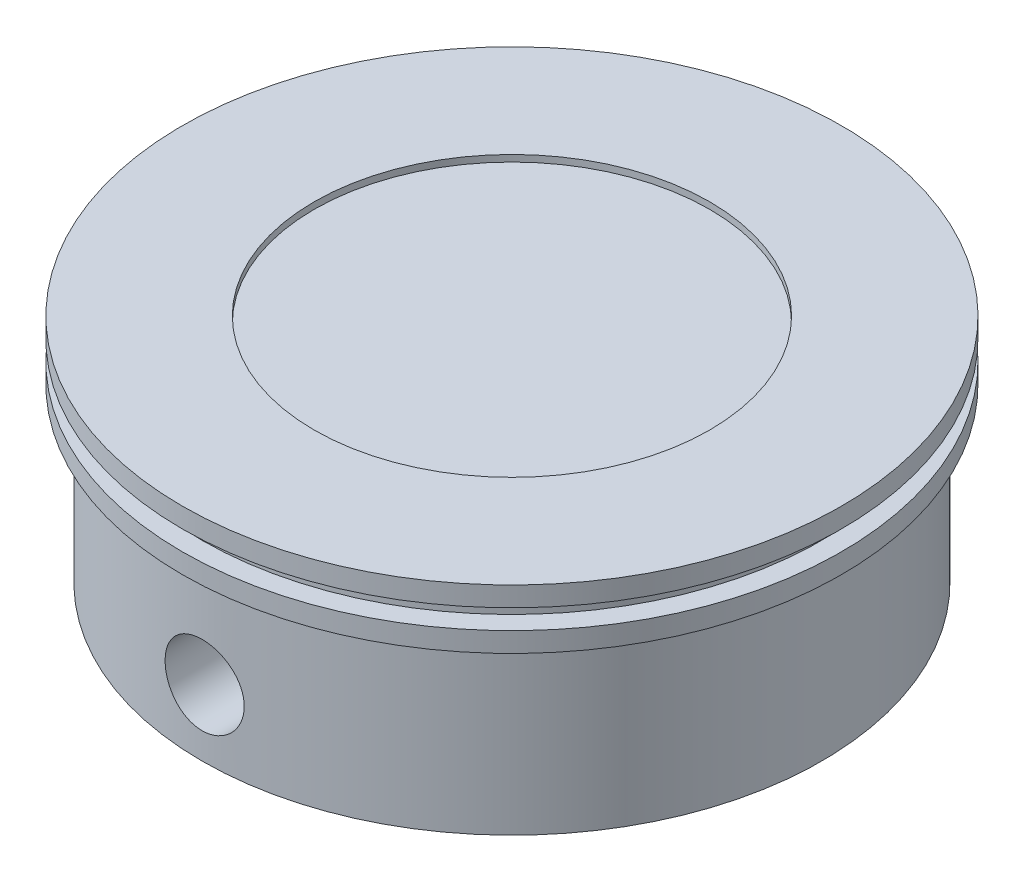
ISO-10303-21;
HEADER;
FILE_DESCRIPTION(('STEP AP214'),'2;1');
FILE_NAME('part.step','',(''),(''),'','','');
FILE_SCHEMA(('AUTOMOTIVE_DESIGN { 1 0 10303 214 1 1 1 1 }'));
ENDSEC;
DATA;
#1=APPLICATION_CONTEXT('core data for automotive mechanical design processes');
#2=APPLICATION_PROTOCOL_DEFINITION('international standard','automotive_design',2000,#1);
#3=PRODUCT_CONTEXT('',#1,'mechanical');
#4=PRODUCT('Part','Part','',(#3));
#5=PRODUCT_RELATED_PRODUCT_CATEGORY('part','',(#4));
#6=PRODUCT_DEFINITION_FORMATION('','',#4);
#7=PRODUCT_DEFINITION_CONTEXT('part definition',#1,'design');
#8=PRODUCT_DEFINITION('design','',#6,#7);
#9=PRODUCT_DEFINITION_SHAPE('','',#8);
#10=(LENGTH_UNIT() NAMED_UNIT(*) SI_UNIT(.MILLI.,.METRE.));
#11=(NAMED_UNIT(*) PLANE_ANGLE_UNIT() SI_UNIT($,.RADIAN.));
#12=(NAMED_UNIT(*) SI_UNIT($,.STERADIAN.) SOLID_ANGLE_UNIT());
#13=UNCERTAINTY_MEASURE_WITH_UNIT(LENGTH_MEASURE(1.E-05),#10,'distance_accuracy_value','');
#14=(GEOMETRIC_REPRESENTATION_CONTEXT(3) GLOBAL_UNCERTAINTY_ASSIGNED_CONTEXT((#13)) GLOBAL_UNIT_ASSIGNED_CONTEXT((#10,
#11,#12)) REPRESENTATION_CONTEXT('',''));
#15=CARTESIAN_POINT('',(0.,0.,0.));
#16=DIRECTION('',(0.,0.,1.));
#17=DIRECTION('',(1.,0.,0.));
#18=AXIS2_PLACEMENT_3D('',#15,#16,#17);
#19=CARTESIAN_POINT('',(0.,-14.0648148148148,0.));
#20=DIRECTION('',(0.,1.,0.));
#21=DIRECTION('',(0.,0.,1.));
#22=AXIS2_PLACEMENT_3D('',#19,#20,#21);
#23=PLANE('',#22);
#24=CARTESIAN_POINT('',(0.,-14.0648148148148,0.));
#25=DIRECTION('',(0.,-1.,0.));
#26=DIRECTION('',(0.,0.,-1.));
#27=AXIS2_PLACEMENT_3D('',#24,#25,#26);
#28=CIRCLE('',#27,30.);
#29=CARTESIAN_POINT('',(0.,-14.0648148148148,-30.));
#30=VERTEX_POINT('',#29);
#31=EDGE_CURVE('E129',#30,#30,#28,.T.);
#32=ORIENTED_EDGE('',*,*,#31,.F.);
#33=EDGE_LOOP('',(#32));
#34=FACE_BOUND('',#33,.T.);
#35=CARTESIAN_POINT('',(0.,-14.0648148148148,0.));
#36=DIRECTION('',(0.,1.,0.));
#37=DIRECTION('',(0.,0.,1.));
#38=AXIS2_PLACEMENT_3D('',#35,#36,#37);
#39=CIRCLE('',#38,47.);
#40=CARTESIAN_POINT('',(0.,-14.0648148148148,47.));
#41=VERTEX_POINT('',#40);
#42=EDGE_CURVE('E10',#41,#41,#39,.T.);
#43=ORIENTED_EDGE('',*,*,#42,.F.);
#44=EDGE_LOOP('',(#43));
#45=FACE_BOUND('',#44,.T.);
#46=ADVANCED_FACE('F31',(#34,#45),#23,.F.);
#47=CARTESIAN_POINT('',(0.,20.9351851851852,0.));
#48=DIRECTION('',(0.,1.,0.));
#49=DIRECTION('',(0.,0.,1.));
#50=AXIS2_PLACEMENT_3D('',#47,#48,#49);
#51=CYLINDRICAL_SURFACE('',#50,47.);
#52=CARTESIAN_POINT('',(6.,-4.06481481481481,-46.6154480832267));
#53=CARTESIAN_POINT('',(6.00000196138387,-3.89698301913016,-46.6154473928351));
#54=CARTESIAN_POINT('',(5.99295562179024,-3.72917986886561,-46.6163562902828));
#55=CARTESIAN_POINT('',(5.96482465134181,-3.39472070375308,-46.619964373645));
#56=CARTESIAN_POINT('',(5.94373685983059,-3.22806495571445,-46.6226639626342));
#57=CARTESIAN_POINT('',(5.88765444257299,-2.89702485864699,-46.6297793289132));
#58=CARTESIAN_POINT('',(5.85264953950258,-2.73264228131749,-46.6341963744345));
#59=CARTESIAN_POINT('',(5.76897846514975,-2.40737825607982,-46.6446209557841));
#60=CARTESIAN_POINT('',(5.7203072882093,-2.24649811434681,-46.6506290743418));
#61=CARTESIAN_POINT('',(5.60972590569106,-1.92960804180157,-46.6640554497734));
#62=CARTESIAN_POINT('',(5.54782981942478,-1.7735931187221,-46.6714722018168));
#63=CARTESIAN_POINT('',(5.41119174183208,-1.4672895933687,-46.6875115459794));
#64=CARTESIAN_POINT('',(5.33644501884744,-1.31700312532613,-46.6961345820388));
#65=CARTESIAN_POINT('',(5.17470088804053,-1.02334228842754,-46.7143349154737));
#66=CARTESIAN_POINT('',(5.08771016996276,-0.879964202085282,-46.7239116909251));
#67=CARTESIAN_POINT('',(4.90202753061555,-0.600970767862642,-46.7437572683162));
#68=CARTESIAN_POINT('',(4.8033312761572,-0.465358322408734,-46.7540263259159));
#69=CARTESIAN_POINT('',(4.59444810261927,-0.202251245275427,-46.7750159174757));
#70=CARTESIAN_POINT('',(4.48420784963096,-0.074799108468153,-46.7857383970622));
#71=CARTESIAN_POINT('',(4.25336390551098,0.170425695379805,-46.8072893337701));
#72=CARTESIAN_POINT('',(4.13275639635765,0.288194764859899,-46.8181178286224));
#73=CARTESIAN_POINT('',(3.88209272514657,0.513143837596703,-46.8395684210856));
#74=CARTESIAN_POINT('',(3.75203957371098,0.62032718937295,-46.8501905831051));
#75=CARTESIAN_POINT('',(3.48330532790937,0.823432557743039,-46.8709371531523));
#76=CARTESIAN_POINT('',(3.34462106875755,0.919350405927563,-46.8810613761346));
#77=CARTESIAN_POINT('',(3.05919121476146,1.09947740865912,-46.9005529648045));
#78=CARTESIAN_POINT('',(2.91242201313194,1.1836494309159,-46.9099178926984));
#79=CARTESIAN_POINT('',(2.61219783113748,1.33935327066616,-46.9275936662918));
#80=CARTESIAN_POINT('',(2.45874038939118,1.41088038481983,-46.935904119451));
#81=CARTESIAN_POINT('',(2.14632461863652,1.54070726026251,-46.9512269280142));
#82=CARTESIAN_POINT('',(1.98736851593013,1.59901230431264,-46.9582398016478));
#83=CARTESIAN_POINT('',(1.66503326060465,1.70201689659562,-46.9707757437606));
#84=CARTESIAN_POINT('',(1.50165250779416,1.74671144901397,-46.9762982651125));
#85=CARTESIAN_POINT('',(1.0085416390629,1.85935739719462,-46.9903178080245));
#86=CARTESIAN_POINT('',(0.673772658507812,1.90672845377963,-46.9963714271072));
#87=CARTESIAN_POINT('',(0.00116856767452578,1.94464581142033,-47.0012054263665));
#88=CARTESIAN_POINT('',(-0.336666416528268,1.93519443856246,-46.9999861042685));
#89=CARTESIAN_POINT('',(-1.00396247855509,1.86005407580517,-46.9904534013821));
#90=CARTESIAN_POINT('',(-1.33346084614895,1.79469266985978,-46.9821813443819));
#91=CARTESIAN_POINT('',(-1.97676049714717,1.61007992427992,-46.9595156526157));
#92=CARTESIAN_POINT('',(-2.2905614712102,1.49082752310468,-46.9451218972653));
#93=CARTESIAN_POINT('',(-2.89458674366409,1.20147607763343,-46.911759785554));
#94=CARTESIAN_POINT('',(-3.184742574148,1.03123561150983,-46.8927787343963));
#95=CARTESIAN_POINT('',(-3.73248989239658,0.644842025811271,-46.8523645801171));
#96=CARTESIAN_POINT('',(-3.99007982179162,0.428686710407619,-46.8309313597459));
#97=CARTESIAN_POINT('',(-4.46731017913027,-0.0452346433143295,-46.7878304300752));
#98=CARTESIAN_POINT('',(-4.68666700801978,-0.303286307102104,-46.7661621383383));
#99=CARTESIAN_POINT('',(-5.07899895813614,-0.852695192784185,-46.7251838158909));
#100=CARTESIAN_POINT('',(-5.25197392246868,-1.14405252733566,-46.7058737931578));
#101=CARTESIAN_POINT('',(-5.54665047586607,-1.75205905797309,-46.6717986516514));
#102=CARTESIAN_POINT('',(-5.66832871748694,-2.06871969289948,-46.6570356032323));
#103=CARTESIAN_POINT('',(-5.85670300534093,-2.7182098620688,-46.633765893936));
#104=CARTESIAN_POINT('',(-5.92340181942937,-3.05103858146079,-46.6252589181086));
#105=CARTESIAN_POINT('',(-5.99954703348947,-3.7209105779837,-46.6155223439954));
#106=CARTESIAN_POINT('',(-6.00939283176584,-4.05790774488393,-46.6142419794573));
#107=CARTESIAN_POINT('',(-5.97260692814951,-4.72874681088903,-46.6189692812959));
#108=CARTESIAN_POINT('',(-5.92597648317739,-5.06258878004851,-46.6249767854757));
#109=CARTESIAN_POINT('',(-5.77789831262942,-5.7164400457885,-46.6435565755976));
#110=CARTESIAN_POINT('',(-5.67664452966124,-6.03649398187811,-46.656105630188));
#111=CARTESIAN_POINT('',(-5.42239366746153,-6.65508162502512,-46.6863356879747));
#112=CARTESIAN_POINT('',(-5.26939469646755,-6.95361454480733,-46.7040168787944));
#113=CARTESIAN_POINT('',(-4.91501706323073,-7.52249131223362,-46.742640400977));
#114=CARTESIAN_POINT('',(-4.71337681640736,-7.79267100544766,-46.7636001419327));
#115=CARTESIAN_POINT('',(-4.26780842975467,-8.29549564894979,-46.8063646525151));
#116=CARTESIAN_POINT('',(-4.02387857282541,-8.52813907439879,-46.8281694564261));
#117=CARTESIAN_POINT('',(-3.49891361841362,-8.95069381797976,-46.8703235870843));
#118=CARTESIAN_POINT('',(-3.21766625060733,-9.14034247113741,-46.8906634752854));
#119=CARTESIAN_POINT('',(-2.62706343658303,-9.46970389090829,-46.9274538311665));
#120=CARTESIAN_POINT('',(-2.31770857782799,-9.6094177008879,-46.9439043801101));
#121=CARTESIAN_POINT('',(-1.68060315098178,-9.83451720253042,-46.9710225699938));
#122=CARTESIAN_POINT('',(-1.3529065011709,-9.92005387753649,-46.9817062698496));
#123=CARTESIAN_POINT('',(-0.687471530743523,-10.0348392799876,-46.9961467462938));
#124=CARTESIAN_POINT('',(-0.349733684177261,-10.0640906604198,-46.9999038493646));
#125=CARTESIAN_POINT('',(0.155414487600213,-10.0651558661215,-47.0000453799811));
#126=CARTESIAN_POINT('',(0.32304579120311,-10.058460423318,-46.9991877470996));
#127=CARTESIAN_POINT('',(0.657125530079888,-10.0310715562085,-46.9957018174569));
#128=CARTESIAN_POINT('',(0.823574382798626,-10.0103833482218,-46.9930741805315));
#129=CARTESIAN_POINT('',(1.15416949463592,-9.95514629663881,-46.9861178205984));
#130=CARTESIAN_POINT('',(1.31831489631992,-9.92059242629868,-46.9817884806809));
#131=CARTESIAN_POINT('',(1.64303550699686,-9.83789801581261,-46.971553151201));
#132=CARTESIAN_POINT('',(1.80361199144733,-9.7897624165468,-46.9656477350396));
#133=CARTESIAN_POINT('',(2.12011906321093,-9.68025233046911,-46.9524247250065));
#134=CARTESIAN_POINT('',(2.27604977270367,-9.61887819216905,-46.9451071683106));
#135=CARTESIAN_POINT('',(2.58212713012573,-9.48335902110499,-46.9292669557423));
#136=CARTESIAN_POINT('',(2.73227585262613,-9.40921862210174,-46.9207447373253));
#137=CARTESIAN_POINT('',(3.02586328994276,-9.24865082331831,-46.9027269191188));
#138=CARTESIAN_POINT('',(3.16929951472505,-9.16221891121371,-46.8932309622198));
#139=CARTESIAN_POINT('',(3.44836470086819,-8.97773140923309,-46.8735356469064));
#140=CARTESIAN_POINT('',(3.58399644203782,-8.87967999655229,-46.8633365418209));
#141=CARTESIAN_POINT('',(3.84752424090652,-8.67186566867687,-46.8424397010973));
#142=CARTESIAN_POINT('',(3.97535760886557,-8.56202355439998,-46.8317389054327));
#143=CARTESIAN_POINT('',(4.22128400518495,-8.33202654975691,-46.8102125172669));
#144=CARTESIAN_POINT('',(4.33938054507479,-8.21187540946405,-46.7993869713758));
#145=CARTESIAN_POINT('',(4.56513110217345,-7.96198646035164,-46.7779055324167));
#146=CARTESIAN_POINT('',(4.67277876520251,-7.83224290161675,-46.7672497458341));
#147=CARTESIAN_POINT('',(4.87675729092901,-7.5641852745767,-46.7464196352422));
#148=CARTESIAN_POINT('',(4.97309231788006,-7.42587438877823,-46.7362451348971));
#149=CARTESIAN_POINT('',(5.15420880046498,-7.14097300958211,-46.7166187712203));
#150=CARTESIAN_POINT('',(5.23893743876834,-6.99434869724065,-46.7071702921043));
#151=CARTESIAN_POINT('',(5.39569533598083,-6.69447023921627,-46.6893210003836));
#152=CARTESIAN_POINT('',(5.46772925493888,-6.54121855218295,-46.6809198036694));
#153=CARTESIAN_POINT('',(5.59855871319342,-6.2292375803858,-46.6654099077882));
#154=CARTESIAN_POINT('',(5.65736452988588,-6.07051265933318,-46.6583002060439));
#155=CARTESIAN_POINT('',(5.76135977734449,-5.74866100610757,-46.6455728925643));
#156=CARTESIAN_POINT('',(5.80655240623859,-5.58553531762807,-46.6399549304133));
#157=CARTESIAN_POINT('',(5.89627278657224,-5.19877157706881,-46.6287112296917));
#158=CARTESIAN_POINT('',(5.93513009231538,-4.9737744659456,-46.6237590192078));
#159=CARTESIAN_POINT('',(5.98699226298512,-4.52077221071258,-46.6171279280011));
#160=CARTESIAN_POINT('',(5.99999733601185,-4.29276709083091,-46.6154490209294));
#161=CARTESIAN_POINT('',(6.,-4.06481481481481,-46.6154480832267));
#162=B_SPLINE_CURVE_WITH_KNOTS('',3,(#52,#53,#54,#55,#56,#57,#58,#59,#60,#61,#62,#63,#64,#65,
#66,#67,#68,#69,#70,#71,#72,#73,#74,#75,#76,#77,#78,#79,#80,#81,#82,#83,#84,#85,#86,#87,#88,#89,
#90,#91,#92,#93,#94,#95,#96,#97,#98,#99,#100,#101,#102,#103,#104,#105,#106,#107,#108,#109,#110,
#111,#112,#113,#114,#115,#116,#117,#118,#119,#120,#121,#122,#123,#124,#125,#126,#127,#128,#129,
#130,#131,#132,#133,#134,#135,#136,#137,#138,#139,#140,#141,#142,#143,#144,#145,#146,#147,#148,
#149,#150,#151,#152,#153,#154,#155,#156,#157,#158,#159,#160,#161),.UNSPECIFIED.,.T.,.F.,(4,2,2,
2,2,2,2,2,2,2,2,2,2,2,2,2,2,2,2,2,2,2,2,2,2,2,2,2,2,2,2,2,2,2,2,2,2,2,2,2,2,2,2,2,2,2,2,2,2,2,2,
2,2,2,4),(0.,0.503295853069418,1.00670503368246,1.51048665779389,2.01445304737243,
2.51788405204308,3.02150082067288,3.5248434889868,4.02837307114363,4.53434122345331,
5.04049651712505,5.54649118530195,6.05267249333814,6.5604194073411,7.06835478491862,
7.57608686244979,8.08400508214156,9.09319790002438,10.1023494058099,11.1056283504083,
12.1089270583814,13.1150347261271,14.1211905207362,15.1345183698274,16.1478496466239,
17.1616416393884,18.1753825912254,19.1819931611844,20.1885813286923,21.1916188583688,
22.1946930622551,23.2032868485705,24.2119215967697,25.2265615516824,26.2411803049042,
27.2529588841646,28.2646897724355,28.7675018124095,29.2701265138851,29.772933597669,
30.2755580012099,30.7781691745011,31.2805982984487,31.7832123470587,32.285646251616,
32.7916956924637,33.2975618239067,33.8037336806939,34.3097186244069,34.8179346577092,
35.3259637418472,35.8335967457779,36.3411103989901,37.0247017189166,37.7082875361846),.UNSPECIFIED.);
#163=CARTESIAN_POINT('',(6.,-4.06481481481481,-46.6154480832267));
#164=VERTEX_POINT('',#163);
#165=EDGE_CURVE('E73',#164,#164,#162,.T.);
#166=ORIENTED_EDGE('',*,*,#165,.T.);
#167=EDGE_LOOP('',(#166));
#168=FACE_BOUND('',#167,.T.);
#169=CARTESIAN_POINT('',(0.,-10.0648148148148,47.));
#170=CARTESIAN_POINT('',(-0.167838063171914,-10.0648167751667,47.0000006700689));
#171=CARTESIAN_POINT('',(-0.335647480428463,-10.0577699144069,46.9990992052822));
#172=CARTESIAN_POINT('',(-0.670119348222613,-10.0296368114479,46.9955199655967));
#173=CARTESIAN_POINT('',(-0.83678153206393,-10.0085474092128,46.9928417908798));
#174=CARTESIAN_POINT('',(-1.16783464243473,-9.95246058536392,46.9857808530497));
#175=CARTESIAN_POINT('',(-1.33222379908044,-9.91745289499847,46.9813968314333));
#176=CARTESIAN_POINT('',(-1.65750112124979,-9.83377494243496,46.971046164502));
#177=CARTESIAN_POINT('',(-1.81838798098412,-9.78509967536645,46.965078939485));
#178=CARTESIAN_POINT('',(-2.13529234312076,-9.67450841517312,46.9517375095164));
#179=CARTESIAN_POINT('',(-2.29131480832223,-9.61260645903108,46.9443647970428));
#180=CARTESIAN_POINT('',(-2.59763276681364,-9.47595521762798,46.9284118296954));
#181=CARTESIAN_POINT('',(-2.74792612576372,-9.401201200475,46.9198311302746));
#182=CARTESIAN_POINT('',(-3.04159950802574,-9.23944136529892,46.9017090028021));
#183=CARTESIAN_POINT('',(-3.18498325343239,-9.15244224482474,46.8921681007478));
#184=CARTESIAN_POINT('',(-3.46398644345244,-8.96674202822833,46.8723838470772));
#185=CARTESIAN_POINT('',(-3.59960298516357,-8.86803659878693,46.8621402359345));
#186=CARTESIAN_POINT('',(-3.86270439965156,-8.65914426119373,46.8411893149478));
#187=CARTESIAN_POINT('',(-3.99014757436448,-8.54890502874591,46.830480033159));
#188=CARTESIAN_POINT('',(-4.2353543779693,-8.31806502209659,46.8089407128005));
#189=CARTESIAN_POINT('',(-4.35311440937853,-8.19746043068496,46.798110631033));
#190=CARTESIAN_POINT('',(-4.57804580661147,-7.94680438710518,46.7766422529601));
#191=CARTESIAN_POINT('',(-4.68522050815524,-7.81675593351118,46.7660038971061));
#192=CARTESIAN_POINT('',(-4.88830925133409,-7.54803284767596,46.7452121571749));
#193=CARTESIAN_POINT('',(-4.98421912420406,-7.40935505084315,46.7350589534569));
#194=CARTESIAN_POINT('',(-5.16433711704753,-7.12393029165865,46.7154991311782));
#195=CARTESIAN_POINT('',(-5.24850732718055,-6.97715923037901,46.7060949715382));
#196=CARTESIAN_POINT('',(-5.40420734615754,-6.67693146763742,46.688335644492));
#197=CARTESIAN_POINT('',(-5.47573245148851,-6.52347230479378,46.6799808677508));
#198=CARTESIAN_POINT('',(-5.60555518217977,-6.21105302370854,46.6645693990894));
#199=CARTESIAN_POINT('',(-5.66385809997744,-6.05209513590654,46.6575121880082));
#200=CARTESIAN_POINT('',(-5.76685834775765,-5.72975594495939,46.6448925048256));
#201=CARTESIAN_POINT('',(-5.81155068268855,-5.56637304174039,46.6393305815789));
#202=CARTESIAN_POINT('',(-5.92419026678318,-5.07325242465086,46.6252077973374));
#203=CARTESIAN_POINT('',(-5.9715564291593,-4.73847497658328,46.6191047220756));
#204=CARTESIAN_POINT('',(-6.00946107400212,-4.06585427166896,46.6142327696464));
#205=CARTESIAN_POINT('',(-6.00000193677805,-3.72801114382994,46.6154635852754));
#206=CARTESIAN_POINT('',(-5.92484916783956,-3.06074902279029,46.6250744144596));
#207=CARTESIAN_POINT('',(-5.85949093951704,-2.73129182951519,46.6334117865423));
#208=CARTESIAN_POINT('',(-5.67489877800209,-2.08807287932693,46.6562331587448));
#209=CARTESIAN_POINT('',(-5.55566371038964,-1.77431145305524,46.6707172882891));
#210=CARTESIAN_POINT('',(-5.26634838576136,-1.17033456102762,46.7042475243336));
#211=CARTESIAN_POINT('',(-5.09612270124938,-0.880189501171291,46.7233066476129));
#212=CARTESIAN_POINT('',(-4.7097607885311,-0.332457478040183,46.7638296282482));
#213=CARTESIAN_POINT('',(-4.49362237057658,-0.0748720685906265,46.7852936002773));
#214=CARTESIAN_POINT('',(-4.01971314506608,0.402376949789214,46.8283972755599));
#215=CARTESIAN_POINT('',(-3.76165322668632,0.621753560780879,46.8500371294349));
#216=CARTESIAN_POINT('',(-3.21222072675003,1.01412151142625,46.8909095381125));
#217=CARTESIAN_POINT('',(-2.92084806264533,1.18711273613453,46.9101420869496));
#218=CARTESIAN_POINT('',(-2.312837084126,1.48180104497586,46.9440455645199));
#219=CARTESIAN_POINT('',(-1.99618976522362,1.6034797503487,46.9587148583255));
#220=CARTESIAN_POINT('',(-1.34672858373707,1.79185903270903,46.9818242977622));
#221=CARTESIAN_POINT('',(-1.01391551160221,1.85856229494529,46.990264747636));
#222=CARTESIAN_POINT('',(-0.344051258110957,1.93472431871027,46.9999258680547));
#223=CARTESIAN_POINT('',(-0.00704570979900002,1.94457835839564,47.0011963904482));
#224=CARTESIAN_POINT('',(0.663812087805053,1.90780594640603,46.9965092088112));
#225=CARTESIAN_POINT('',(0.997664407039704,1.86118075049008,46.9905516654895));
#226=CARTESIAN_POINT('',(1.6515695318093,1.71310182072463,46.9721087923421));
#227=CARTESIAN_POINT('',(1.97166579746502,1.61183696340936,46.9596459546098));
#228=CARTESIAN_POINT('',(2.59033321185338,1.35754980661062,46.9295875339441));
#229=CARTESIAN_POINT('',(2.88890360076026,1.20452568119968,46.911991769938));
#230=CARTESIAN_POINT('',(3.45780665218199,0.850110602799546,46.8735042969029));
#231=CARTESIAN_POINT('',(3.72797914360136,0.648464444638696,46.852595403501));
#232=CARTESIAN_POINT('',(4.23078651042323,0.202888570455249,46.8098733304061));
#233=CARTESIAN_POINT('',(4.4634198284497,-0.0410428989745467,46.7880601132429));
#234=CARTESIAN_POINT('',(4.88595165179015,-0.566003602722403,46.7458335083363));
#235=CARTESIAN_POINT('',(5.07558784134227,-0.847244788533533,46.7254292148124));
#236=CARTESIAN_POINT('',(5.4049274086329,-1.43783181315145,46.68848195593));
#237=CARTESIAN_POINT('',(5.54463182342381,-1.74717706808653,46.6719389103782));
#238=CARTESIAN_POINT('',(5.76972534189866,-2.38428768141588,46.6446476199947));
#239=CARTESIAN_POINT('',(5.85526135969028,-2.712000569617,46.6338837133221));
#240=CARTESIAN_POINT('',(5.97003993389989,-3.37746991580596,46.6193320464658));
#241=CARTESIAN_POINT('',(5.99928523108511,-3.71522588398806,46.6155439466339));
#242=CARTESIAN_POINT('',(6.00033683445372,-4.22037783221464,46.6154028084788));
#243=CARTESIAN_POINT('',(5.99363795782986,-4.38799550518256,46.6162680564192));
#244=CARTESIAN_POINT('',(5.96624454493278,-4.72204758736202,46.6197829672527));
#245=CARTESIAN_POINT('',(5.94555522452868,-4.88848241419896,46.6224319651327));
#246=CARTESIAN_POINT('',(5.89031836084445,-5.2190492570868,46.6294425289123));
#247=CARTESIAN_POINT('',(5.85576578214887,-5.38318041395461,46.6338047170649));
#248=CARTESIAN_POINT('',(5.7730764734767,-5.70787248854002,46.6441135047553));
#249=CARTESIAN_POINT('',(5.72494468158316,-5.86843468125671,46.6500595282872));
#250=CARTESIAN_POINT('',(5.61544528323687,-6.18491199292609,46.6633669196045));
#251=CARTESIAN_POINT('',(5.5540781536318,-6.34082727906898,46.6707282363982));
#252=CARTESIAN_POINT('',(5.41857564866717,-6.64687486326822,46.686654270506));
#253=CARTESIAN_POINT('',(5.3444449047887,-6.79700923492499,46.6952185510986));
#254=CARTESIAN_POINT('',(5.18389871337334,-7.09056973990504,46.7133141470462));
#255=CARTESIAN_POINT('',(5.09747874750328,-7.23399338002675,46.7228458177072));
#256=CARTESIAN_POINT('',(4.9130169942028,-7.51303566392164,46.7426022099528));
#257=CARTESIAN_POINT('',(4.81497938214356,-7.64865708592979,46.7528266819829));
#258=CARTESIAN_POINT('',(4.60717979921201,-7.91218495215388,46.7737626757223));
#259=CARTESIAN_POINT('',(4.49733711614385,-8.04002752096667,46.7844772194701));
#260=CARTESIAN_POINT('',(4.26733706918917,-8.28597242902162,46.8060163492218));
#261=CARTESIAN_POINT('',(4.1471834561496,-8.40407827982983,46.8168408939575));
#262=CARTESIAN_POINT('',(3.89728772191158,-8.62984713752657,46.8383056996592));
#263=CARTESIAN_POINT('',(3.76753985931779,-8.73750380083345,46.8489458454991));
#264=CARTESIAN_POINT('',(3.49947183631539,-8.94149968362224,46.8697318074739));
#265=CARTESIAN_POINT('',(3.36115486016694,-9.0378430690106,46.8798778047596));
#266=CARTESIAN_POINT('',(3.07624888081241,-9.21896946622906,46.8994367236439));
#267=CARTESIAN_POINT('',(2.92962654223609,-9.30370042112103,46.908846267936));
#268=CARTESIAN_POINT('',(2.62975182776426,-9.46046314949935,46.9266124464756));
#269=CARTESIAN_POINT('',(2.47650191050208,-9.53249958279075,46.9349694667527));
#270=CARTESIAN_POINT('',(2.16452444951248,-9.66333419956403,46.9503908111547));
#271=CARTESIAN_POINT('',(2.00580126419063,-9.72214264810742,46.957456136846));
#272=CARTESIAN_POINT('',(1.68395339707003,-9.82614323067983,46.9700995139501));
#273=CARTESIAN_POINT('',(1.52082975816969,-9.87133856063097,46.9756779144096));
#274=CARTESIAN_POINT('',(1.13404987394811,-9.96107046228845,46.9868403938357));
#275=CARTESIAN_POINT('',(0.909034147009859,-9.99993422346207,46.9917544763537));
#276=CARTESIAN_POINT('',(0.455994647881422,-10.0518049673627,46.9983338116741));
#277=CARTESIAN_POINT('',(0.227970899207277,-10.0648121521103,46.9999990898596));
#278=CARTESIAN_POINT('',(0.,-10.0648148148148,47.));
#279=B_SPLINE_CURVE_WITH_KNOTS('',3,(#169,#170,#171,#172,#173,#174,#175,#176,#177,#178,#179,
#180,#181,#182,#183,#184,#185,#186,#187,#188,#189,#190,#191,#192,#193,#194,#195,#196,#197,#198,
#199,#200,#201,#202,#203,#204,#205,#206,#207,#208,#209,#210,#211,#212,#213,#214,#215,#216,#217,
#218,#219,#220,#221,#222,#223,#224,#225,#226,#227,#228,#229,#230,#231,#232,#233,#234,#235,#236,
#237,#238,#239,#240,#241,#242,#243,#244,#245,#246,#247,#248,#249,#250,#251,#252,#253,#254,#255,
#256,#257,#258,#259,#260,#261,#262,#263,#264,#265,#266,#267,#268,#269,#270,#271,#272,#273,#274,
#275,#276,#277,#278),.UNSPECIFIED.,.T.,.F.,(4,2,2,2,2,2,2,2,2,2,2,2,2,2,2,2,2,2,2,2,2,2,2,2,2,2,
2,2,2,2,2,2,2,2,2,2,2,2,2,2,2,2,2,2,2,2,2,2,2,2,2,2,2,2,4),(0.,0.503314675901855,
1.0067426525362,1.5105427438075,2.01452756057316,2.51798015061834,3.0216185011441,
3.52498244579989,4.02853330547609,4.53447671532464,5.04060725195719,5.54657778102221,
6.0527349680842,6.5604905666057,7.06843463594216,7.57617503053625,8.08410154071721,
9.09331867811206,10.1024935415172,11.1056553381931,12.108838258229,13.1149099917499,
14.1210297193339,15.1344081953881,16.1477891826243,17.1615328279425,18.1752269545105,
19.1818641923443,20.1884790490216,21.1916363595262,22.1948290624081,23.2034065064329,
24.2120257822453,25.2266420829244,26.2412373094191,27.2530688574889,28.2648511387369,
28.7676228533348,29.2702072295788,29.7729743201185,30.2755588144681,30.7781252045396,
31.2805096132394,31.7830792116453,32.2854687317065,32.7915427253168,33.2974333965589,
33.803629292042,34.3096382017739,34.8178460567718,35.3258669724804,35.833492287759,
36.3409983358967,37.0246453798233,37.7082870823139),.UNSPECIFIED.);
#280=CARTESIAN_POINT('',(0.,-10.0648148148148,47.));
#281=VERTEX_POINT('',#280);
#282=EDGE_CURVE('E78',#281,#281,#279,.T.);
#283=ORIENTED_EDGE('',*,*,#282,.T.);
#284=EDGE_LOOP('',(#283));
#285=FACE_BOUND('',#284,.T.);
#286=CARTESIAN_POINT('',(0.,11.9351851851852,0.));
#287=DIRECTION('',(0.,1.,0.));
#288=DIRECTION('',(0.,0.,1.));
#289=AXIS2_PLACEMENT_3D('',#286,#287,#288);
#290=CIRCLE('',#289,47.);
#291=CARTESIAN_POINT('',(0.,11.9351851851852,47.));
#292=VERTEX_POINT('',#291);
#293=EDGE_CURVE('E42',#292,#292,#290,.T.);
#294=ORIENTED_EDGE('',*,*,#293,.F.);
#295=EDGE_LOOP('',(#294));
#296=FACE_BOUND('',#295,.T.);
#297=ORIENTED_EDGE('',*,*,#42,.T.);
#298=EDGE_LOOP('',(#297));
#299=FACE_BOUND('',#298,.T.);
#300=ADVANCED_FACE('F84',(#168,#285,#296,#299),#51,.T.);
#301=CARTESIAN_POINT('',(47.,11.9351851851852,0.));
#302=DIRECTION('',(0.,1.,0.));
#303=DIRECTION('',(0.,0.,1.));
#304=AXIS2_PLACEMENT_3D('',#301,#302,#303);
#305=PLANE('',#304);
#306=CARTESIAN_POINT('',(0.,11.9351851851852,0.));
#307=DIRECTION('',(0.,1.,0.));
#308=DIRECTION('',(0.,0.,1.));
#309=AXIS2_PLACEMENT_3D('',#306,#307,#308);
#310=CIRCLE('',#309,50.);
#311=CARTESIAN_POINT('',(0.,11.9351851851852,50.));
#312=VERTEX_POINT('',#311);
#313=EDGE_CURVE('E47',#312,#312,#310,.T.);
#314=ORIENTED_EDGE('',*,*,#313,.F.);
#315=EDGE_LOOP('',(#314));
#316=FACE_BOUND('',#315,.T.);
#317=ORIENTED_EDGE('',*,*,#293,.T.);
#318=EDGE_LOOP('',(#317));
#319=FACE_BOUND('',#318,.T.);
#320=ADVANCED_FACE('F88',(#316,#319),#305,.F.);
#321=CARTESIAN_POINT('',(0.,20.9351851851852,0.));
#322=DIRECTION('',(0.,1.,0.));
#323=DIRECTION('',(0.,0.,1.));
#324=AXIS2_PLACEMENT_3D('',#321,#322,#323);
#325=CYLINDRICAL_SURFACE('',#324,50.);
#326=CARTESIAN_POINT('',(0.,14.9351851851852,0.));
#327=DIRECTION('',(0.,1.,0.));
#328=DIRECTION('',(0.,0.,1.));
#329=AXIS2_PLACEMENT_3D('',#326,#327,#328);
#330=CIRCLE('',#329,50.);
#331=CARTESIAN_POINT('',(0.,14.9351851851852,50.));
#332=VERTEX_POINT('',#331);
#333=EDGE_CURVE('E148',#332,#332,#330,.T.);
#334=ORIENTED_EDGE('',*,*,#333,.F.);
#335=EDGE_LOOP('',(#334));
#336=FACE_BOUND('',#335,.T.);
#337=ORIENTED_EDGE('',*,*,#313,.T.);
#338=EDGE_LOOP('',(#337));
#339=FACE_BOUND('',#338,.T.);
#340=ADVANCED_FACE('F93',(#336,#339),#325,.T.);
#341=CARTESIAN_POINT('',(50.,14.9351851851852,0.));
#342=DIRECTION('',(0.,-1.,0.));
#343=DIRECTION('',(0.,0.,-1.));
#344=AXIS2_PLACEMENT_3D('',#341,#342,#343);
#345=PLANE('',#344);
#346=CARTESIAN_POINT('',(0.,14.9351851851852,0.));
#347=DIRECTION('',(0.,1.,0.));
#348=DIRECTION('',(0.,0.,1.));
#349=AXIS2_PLACEMENT_3D('',#346,#347,#348);
#350=CIRCLE('',#349,47.);
#351=CARTESIAN_POINT('',(0.,14.9351851851852,47.));
#352=VERTEX_POINT('',#351);
#353=EDGE_CURVE('E145',#352,#352,#350,.T.);
#354=ORIENTED_EDGE('',*,*,#353,.F.);
#355=EDGE_LOOP('',(#354));
#356=FACE_BOUND('',#355,.T.);
#357=ORIENTED_EDGE('',*,*,#333,.T.);
#358=EDGE_LOOP('',(#357));
#359=FACE_BOUND('',#358,.T.);
#360=ADVANCED_FACE('F97',(#356,#359),#345,.F.);
#361=CARTESIAN_POINT('',(0.,20.9351851851852,0.));
#362=DIRECTION('',(0.,1.,0.));
#363=DIRECTION('',(0.,0.,1.));
#364=AXIS2_PLACEMENT_3D('',#361,#362,#363);
#365=CYLINDRICAL_SURFACE('',#364,47.);
#366=CARTESIAN_POINT('',(0.,17.9351851851852,0.));
#367=DIRECTION('',(0.,1.,0.));
#368=DIRECTION('',(0.,0.,1.));
#369=AXIS2_PLACEMENT_3D('',#366,#367,#368);
#370=CIRCLE('',#369,47.);
#371=CARTESIAN_POINT('',(0.,17.9351851851852,47.));
#372=VERTEX_POINT('',#371);
#373=EDGE_CURVE('E142',#372,#372,#370,.T.);
#374=ORIENTED_EDGE('',*,*,#373,.F.);
#375=EDGE_LOOP('',(#374));
#376=FACE_BOUND('',#375,.T.);
#377=ORIENTED_EDGE('',*,*,#353,.T.);
#378=EDGE_LOOP('',(#377));
#379=FACE_BOUND('',#378,.T.);
#380=ADVANCED_FACE('F101',(#376,#379),#365,.T.);
#381=CARTESIAN_POINT('',(47.,17.9351851851852,0.));
#382=DIRECTION('',(0.,1.,0.));
#383=DIRECTION('',(0.,0.,1.));
#384=AXIS2_PLACEMENT_3D('',#381,#382,#383);
#385=PLANE('',#384);
#386=CARTESIAN_POINT('',(0.,17.9351851851852,0.));
#387=DIRECTION('',(0.,1.,0.));
#388=DIRECTION('',(0.,0.,1.));
#389=AXIS2_PLACEMENT_3D('',#386,#387,#388);
#390=CIRCLE('',#389,50.);
#391=CARTESIAN_POINT('',(0.,17.9351851851852,50.));
#392=VERTEX_POINT('',#391);
#393=EDGE_CURVE('E139',#392,#392,#390,.T.);
#394=ORIENTED_EDGE('',*,*,#393,.F.);
#395=EDGE_LOOP('',(#394));
#396=FACE_BOUND('',#395,.T.);
#397=ORIENTED_EDGE('',*,*,#373,.T.);
#398=EDGE_LOOP('',(#397));
#399=FACE_BOUND('',#398,.T.);
#400=ADVANCED_FACE('F105',(#396,#399),#385,.F.);
#401=CARTESIAN_POINT('',(0.,20.9351851851852,0.));
#402=DIRECTION('',(0.,1.,0.));
#403=DIRECTION('',(0.,0.,1.));
#404=AXIS2_PLACEMENT_3D('',#401,#402,#403);
#405=CYLINDRICAL_SURFACE('',#404,50.);
#406=CARTESIAN_POINT('',(0.,20.9351851851852,0.));
#407=DIRECTION('',(0.,1.,0.));
#408=DIRECTION('',(0.,0.,1.));
#409=AXIS2_PLACEMENT_3D('',#406,#407,#408);
#410=CIRCLE('',#409,50.);
#411=CARTESIAN_POINT('',(0.,20.9351851851852,50.));
#412=VERTEX_POINT('',#411);
#413=EDGE_CURVE('E134',#412,#412,#410,.T.);
#414=ORIENTED_EDGE('',*,*,#413,.F.);
#415=EDGE_LOOP('',(#414));
#416=FACE_BOUND('',#415,.T.);
#417=ORIENTED_EDGE('',*,*,#393,.T.);
#418=EDGE_LOOP('',(#417));
#419=FACE_BOUND('',#418,.T.);
#420=ADVANCED_FACE('F109',(#416,#419),#405,.T.);
#421=CARTESIAN_POINT('',(50.,20.9351851851852,0.));
#422=DIRECTION('',(0.,-1.,0.));
#423=DIRECTION('',(0.,0.,-1.));
#424=AXIS2_PLACEMENT_3D('',#421,#422,#423);
#425=PLANE('',#424);
#426=CARTESIAN_POINT('',(0.,20.9351851851852,0.));
#427=DIRECTION('',(0.,1.,0.));
#428=DIRECTION('',(0.,0.,1.));
#429=AXIS2_PLACEMENT_3D('',#426,#427,#428);
#430=CIRCLE('',#429,30.);
#431=CARTESIAN_POINT('',(0.,20.9351851851852,30.));
#432=VERTEX_POINT('',#431);
#433=EDGE_CURVE('E79',#432,#432,#430,.T.);
#434=ORIENTED_EDGE('',*,*,#433,.F.);
#435=EDGE_LOOP('',(#434));
#436=FACE_BOUND('',#435,.T.);
#437=ORIENTED_EDGE('',*,*,#413,.T.);
#438=EDGE_LOOP('',(#437));
#439=FACE_BOUND('',#438,.T.);
#440=ADVANCED_FACE('F112',(#436,#439),#425,.F.);
#441=CARTESIAN_POINT('',(0.,12.9351851851852,0.));
#442=DIRECTION('',(0.,-1.,0.));
#443=DIRECTION('',(0.,0.,-1.));
#444=AXIS2_PLACEMENT_3D('',#441,#442,#443);
#445=CYLINDRICAL_SURFACE('',#444,30.);
#446=CARTESIAN_POINT('',(0.,1.93518518518519,-30.));
#447=CARTESIAN_POINT('',(0.166786652248669,1.93518850843952,-30.0000016877981));
#448=CARTESIAN_POINT('',(0.333531682271038,1.9282289455445,-29.9986067033856));
#449=CARTESIAN_POINT('',(0.665867533260187,1.90045239264547,-29.9930693958679));
#450=CARTESIAN_POINT('',(0.831458154665196,1.87963306393334,-29.9889266090968));
#451=CARTESIAN_POINT('',(1.16032458153253,1.82428290977543,-29.9780042910095));
#452=CARTESIAN_POINT('',(1.32359914543867,1.78974499810015,-29.9712233970364));
#453=CARTESIAN_POINT('',(1.64665330845814,1.70721560167949,-29.9552115074616));
#454=CARTESIAN_POINT('',(1.80643159973362,1.65921917225839,-29.9459796114252));
#455=CARTESIAN_POINT('',(2.12109983239614,1.55022068799255,-29.9253365331517));
#456=CARTESIAN_POINT('',(2.27599604895797,1.48923618127853,-29.9139282935092));
#457=CARTESIAN_POINT('',(2.58011997384533,1.35465400622542,-29.8892333050117));
#458=CARTESIAN_POINT('',(2.72934556700075,1.28105168671796,-29.8759458637642));
#459=CARTESIAN_POINT('',(3.02099738371889,1.12181866961572,-29.847864764448));
#460=CARTESIAN_POINT('',(3.16342661491005,1.03619336001386,-29.8330717818866));
#461=CARTESIAN_POINT('',(3.44066424662778,0.85345761810804,-29.8023705649158));
#462=CARTESIAN_POINT('',(3.57546977430149,0.756342898295781,-29.7864619150799));
#463=CARTESIAN_POINT('',(3.83805424255525,0.550110635047485,-29.7537737589536));
#464=CARTESIAN_POINT('',(3.96573181461115,0.44086528092241,-29.736986207012));
#465=CARTESIAN_POINT('',(4.21150797625133,0.212030318955466,-29.7031748746099));
#466=CARTESIAN_POINT('',(4.32960299872307,0.0924368929555764,-29.6861510089179));
#467=CARTESIAN_POINT('',(4.55533107490252,-0.156215884871105,-29.6523520608897));
#468=CARTESIAN_POINT('',(4.66296713577171,-0.2852724970051,-29.6355769082259));
#469=CARTESIAN_POINT('',(4.86711503039735,-0.552064358037966,-29.6027344612914));
#470=CARTESIAN_POINT('',(4.96362274650856,-0.689802790363691,-29.5866674303854));
#471=CARTESIAN_POINT('',(5.14558410260135,-0.974230269582971,-29.555567373627));
#472=CARTESIAN_POINT('',(5.23093360906967,-1.12098709977661,-29.5405446276672));
#473=CARTESIAN_POINT('',(5.38897820747252,-1.42138264537443,-29.5121223147578));
#474=CARTESIAN_POINT('',(5.46166855194707,-1.57502391555118,-29.4987233573343));
#475=CARTESIAN_POINT('',(5.59377451152129,-1.88800323562382,-29.4739582743493));
#476=CARTESIAN_POINT('',(5.65319606428295,-2.04733870024134,-29.4625912399768));
#477=CARTESIAN_POINT('',(5.75835702118131,-2.37062604477204,-29.4422171898322));
#478=CARTESIAN_POINT('',(5.80409146164025,-2.53457957591603,-29.4332110303858));
#479=CARTESIAN_POINT('',(5.91908595106861,-3.02712961953741,-29.4103859513813));
#480=CARTESIAN_POINT('',(5.96802935351569,-3.36091882820586,-29.4003929278753));
#481=CARTESIAN_POINT('',(6.00933039878669,-4.03192498918038,-29.391977779309));
#482=CARTESIAN_POINT('',(6.00169382762843,-4.36914158747059,-29.3935544710987));
#483=CARTESIAN_POINT('',(5.93072281800691,-5.03228211379936,-29.4079543069083));
#484=CARTESIAN_POINT('',(5.86823000306685,-5.3582996493517,-29.4206075033344));
#485=CARTESIAN_POINT('',(5.69062854619403,-5.99511487419172,-29.4554724377756));
#486=CARTESIAN_POINT('',(5.57551739149991,-6.305911835844,-29.4776846322726));
#487=CARTESIAN_POINT('',(5.29514836690247,-6.9059054109819,-29.5293371998215));
#488=CARTESIAN_POINT('',(5.12955681753243,-7.19494183106417,-29.5588254128989));
#489=CARTESIAN_POINT('',(4.75316153730667,-7.74144017584739,-29.6216771023044));
#490=CARTESIAN_POINT('',(4.54235261042108,-7.99889846648609,-29.6550410237966));
#491=CARTESIAN_POINT('',(4.07699958264663,-8.47979115772274,-29.7226212811101));
#492=CARTESIAN_POINT('',(3.82173696065089,-8.70253020272777,-29.7568421544285));
#493=CARTESIAN_POINT('',(3.27711015099593,-9.10213791186423,-29.8217309210902));
#494=CARTESIAN_POINT('',(2.98774552605447,-9.27900598770952,-29.8523987688639));
#495=CARTESIAN_POINT('',(2.38235631949263,-9.58197986502943,-29.9068014101285));
#496=CARTESIAN_POINT('',(2.06629091702717,-9.70800617540315,-29.9305253310192));
#497=CARTESIAN_POINT('',(1.41689385917656,-9.90497766032494,-29.9682845391487));
#498=CARTESIAN_POINT('',(1.0835643005924,-9.97592950723121,-29.9823210000157));
#499=CARTESIAN_POINT('',(0.415076433607842,-10.0597535376054,-29.9989603120279));
#500=CARTESIAN_POINT('',(0.0800419698068968,-10.0735773333917,-30.0017504790923));
#501=CARTESIAN_POINT('',(-0.587549605009732,-10.0453156598265,-29.996103115862));
#502=CARTESIAN_POINT('',(-0.920106854231609,-10.0032333333835,-29.987666216726));
#503=CARTESIAN_POINT('',(-1.57023396010652,-9.86514457881898,-29.960629920244));
#504=CARTESIAN_POINT('',(-1.8879116915969,-9.769626423493,-29.9421225833633));
#505=CARTESIAN_POINT('',(-2.50274176344041,-9.52791089921288,-29.8970131245511));
#506=CARTESIAN_POINT('',(-2.79989256402195,-9.38170973335128,-29.8704103961733));
#507=CARTESIAN_POINT('',(-3.36924704799164,-9.04071994520811,-29.8115946886373));
#508=CARTESIAN_POINT('',(-3.64110078255833,-8.84535840745352,-29.7793170136105));
#509=CARTESIAN_POINT('',(-4.14850809266767,-8.41235938866883,-29.7128841024069));
#510=CARTESIAN_POINT('',(-4.38405777126515,-8.17471737506373,-29.6787286652006));
#511=CARTESIAN_POINT('',(-4.81584362821802,-7.65957576067742,-29.6117581656033));
#512=CARTESIAN_POINT('',(-5.0114265288049,-7.38152432306102,-29.5789714342849));
#513=CARTESIAN_POINT('',(-5.35311220620684,-6.79594267325951,-29.5190516874779));
#514=CARTESIAN_POINT('',(-5.49921696272725,-6.48841364115534,-29.4919184458003));
#515=CARTESIAN_POINT('',(-5.73691221613725,-5.85422009611058,-29.4466037675913));
#516=CARTESIAN_POINT('',(-5.82878534224624,-5.52766471338782,-29.4283760072868));
#517=CARTESIAN_POINT('',(-5.95624756679947,-4.86315915531197,-29.4028486891946));
#518=CARTESIAN_POINT('',(-5.99184400503047,-4.52521047178275,-29.3955477063081));
#519=CARTESIAN_POINT('',(-6.00215206973579,-4.02081034806572,-29.3934346552141));
#520=CARTESIAN_POINT('',(-5.99862026362255,-3.85454293303202,-29.3941596225182));
#521=CARTESIAN_POINT('',(-5.97778381764729,-3.52292625993515,-29.398405768439));
#522=CARTESIAN_POINT('',(-5.96048440461361,-3.35757667740436,-29.4019258858846));
#523=CARTESIAN_POINT('',(-5.91223531606522,-3.02891599568321,-29.4116654550973));
#524=CARTESIAN_POINT('',(-5.8812808635851,-2.86560563045315,-29.4178858514955));
#525=CARTESIAN_POINT('',(-5.80598159493068,-2.54227892794563,-29.4328396854836));
#526=CARTESIAN_POINT('',(-5.76164155594083,-2.38226143720084,-29.4415722264617));
#527=CARTESIAN_POINT('',(-5.66001374213114,-2.06690757413071,-29.4612782162784));
#528=CARTESIAN_POINT('',(-5.60275321125541,-1.91156212044989,-29.4722469452967));
#529=CARTESIAN_POINT('',(-5.47568162012858,-1.60631277912651,-29.4961198431084));
#530=CARTESIAN_POINT('',(-5.40587500042183,-1.45640698866757,-29.5090233268505));
#531=CARTESIAN_POINT('',(-5.25416908478742,-1.16291773954278,-29.5364122311102));
#532=CARTESIAN_POINT('',(-5.1722647707964,-1.01933693668969,-29.550898307427));
#533=CARTESIAN_POINT('',(-4.99698841845513,-0.73955572022267,-29.5810413663055));
#534=CARTESIAN_POINT('',(-4.90362031566108,-0.603352796772484,-29.5966979463115));
#535=CARTESIAN_POINT('',(-4.70431042269863,-0.336862732456838,-29.6290369146416));
#536=CARTESIAN_POINT('',(-4.59817846517834,-0.206719367166914,-29.6457323939473));
#537=CARTESIAN_POINT('',(-4.37544580818257,0.0441511408121535,-29.6794230412158));
#538=CARTESIAN_POINT('',(-4.25884879925803,0.164881575168012,-29.696418101844));
#539=CARTESIAN_POINT('',(-4.01586865850976,0.396233930310372,-29.7302514245318));
#540=CARTESIAN_POINT('',(-3.88947977330132,0.506849823628204,-29.7470895877948));
#541=CARTESIAN_POINT('',(-3.62787334669382,0.717097513487242,-29.7801260540863));
#542=CARTESIAN_POINT('',(-3.49265907135132,0.816733337189899,-29.7963245903027));
#543=CARTESIAN_POINT('',(-3.21275204243396,1.00539391766488,-29.8278103216068));
#544=CARTESIAN_POINT('',(-3.06797223833864,1.09429156737041,-29.8430856972278));
#545=CARTESIAN_POINT('',(-2.77133359298632,1.25951847758966,-29.8720925023925));
#546=CARTESIAN_POINT('',(-2.61947738602888,1.33585236794773,-29.8858245000888));
#547=CARTESIAN_POINT('',(-2.30978799168465,1.47537458935964,-29.9113522142888));
#548=CARTESIAN_POINT('',(-2.15195848728227,1.53857086953704,-29.923149100746));
#549=CARTESIAN_POINT('',(-1.83142130972696,1.6513704020495,-29.9444772542672));
#550=CARTESIAN_POINT('',(-1.66871458308572,1.70097627313918,-29.9540089577655));
#551=CARTESIAN_POINT('',(-1.25904258819453,1.80705293780879,-29.974570473783));
#552=CARTESIAN_POINT('',(-1.00974899285384,1.85503695799708,-29.9840570283772));
#553=CARTESIAN_POINT('',(-0.506938144370035,1.91910004853451,-29.9967704094865));
#554=CARTESIAN_POINT('',(-0.253421026098677,1.93518013572523,-29.9999974355051));
#555=CARTESIAN_POINT('',(0.,1.93518518518519,-30.));
#556=B_SPLINE_CURVE_WITH_KNOTS('',3,(#446,#447,#448,#449,#450,#451,#452,#453,#454,#455,#456,
#457,#458,#459,#460,#461,#462,#463,#464,#465,#466,#467,#468,#469,#470,#471,#472,#473,#474,#475,
#476,#477,#478,#479,#480,#481,#482,#483,#484,#485,#486,#487,#488,#489,#490,#491,#492,#493,#494,
#495,#496,#497,#498,#499,#500,#501,#502,#503,#504,#505,#506,#507,#508,#509,#510,#511,#512,#513,
#514,#515,#516,#517,#518,#519,#520,#521,#522,#523,#524,#525,#526,#527,#528,#529,#530,#531,#532,
#533,#534,#535,#536,#537,#538,#539,#540,#541,#542,#543,#544,#545,#546,#547,#548,#549,#550,#551,
#552,#553,#554,#555),.UNSPECIFIED.,.T.,.F.,(4,2,2,2,2,2,2,2,2,2,2,2,2,2,2,2,2,2,2,2,2,2,2,2,2,2,
2,2,2,2,2,2,2,2,2,2,2,2,2,2,2,2,2,2,2,2,2,2,2,2,2,2,2,2,4),(0.,0.50013743058896,
1.00035927617204,1.50083984425765,2.0015045309787,2.50149701534762,3.00167420442676,
3.5016279548536,4.00176886524221,4.5077959728965,5.01401059357907,5.52007923403483,
6.02633453023669,6.5370204134371,7.04789740440738,7.55854532244117,8.06937820489228,
9.0765403492237,10.0835994999106,11.0754728634138,12.0673935982609,13.0660186552527,
14.0647585280174,15.0814643925182,16.0981832954263,17.1164857342786,18.1346647849193,
19.135813383613,20.1369057025092,21.1289964800805,22.1211615959985,23.1254732050387,
24.1298925437929,25.1496069577907,26.1692805664451,27.1835921050234,28.1977713429096,
28.696203796003,29.194447111012,29.6928648657148,30.1911049498829,30.6883041108312,
31.1853276391548,31.6825579123547,32.1796179595776,32.6853083779349,33.1908211576101,
33.6966332460677,34.2022591959605,34.7133809876677,35.224314003198,35.7349369648152,
36.2454614644772,37.0054106508197,37.7653356156859),.UNSPECIFIED.);
#557=CARTESIAN_POINT('',(0.,1.93518518518519,-30.));
#558=VERTEX_POINT('',#557);
#559=EDGE_CURVE('E34',#558,#558,#556,.T.);
#560=ORIENTED_EDGE('',*,*,#559,.T.);
#561=EDGE_LOOP('',(#560));
#562=FACE_BOUND('',#561,.T.);
#563=CARTESIAN_POINT('',(6.,-4.06481481481481,29.3938769133981));
#564=CARTESIAN_POINT('',(6.00000333510614,-3.89806568308872,29.393875096905));
#565=CARTESIAN_POINT('',(5.99304686885587,-3.73135818787935,29.3952984818504));
#566=CARTESIAN_POINT('',(5.96528300149183,-3.39909843019845,29.4009458431103));
#567=CARTESIAN_POINT('',(5.94447325865162,-3.23354636782032,29.40517029291));
#568=CARTESIAN_POINT('',(5.88914931201488,-2.90475785659064,29.4163000801468));
#569=CARTESIAN_POINT('',(5.85462796382056,-2.74152266093392,29.4232068151401));
#570=CARTESIAN_POINT('',(5.7721394346217,-2.41854810162065,29.4395002230684));
#571=CARTESIAN_POINT('',(5.72416730423297,-2.25881004815095,29.4488878087902));
#572=CARTESIAN_POINT('',(5.61522748795583,-1.94422744627387,29.4698539103105));
#573=CARTESIAN_POINT('',(5.55427783491521,-1.78937644644919,29.4814293834603));
#574=CARTESIAN_POINT('',(5.41977382716697,-1.48533916520699,29.5064523391392));
#575=CARTESIAN_POINT('',(5.34621482271147,-1.33615499833562,29.5199005118891));
#576=CARTESIAN_POINT('',(5.18707511068997,-1.04457880826826,29.54827876595));
#577=CARTESIAN_POINT('',(5.10149974711649,-0.902183803257724,29.5632081876493));
#578=CARTESIAN_POINT('',(4.91886856337344,-0.625005449780726,29.594143163833));
#579=CARTESIAN_POINT('',(4.82180845652764,-0.490224971341622,29.6101491191652));
#580=CARTESIAN_POINT('',(4.61563131912603,-0.227607666244683,29.6429919960716));
#581=CARTESIAN_POINT('',(4.50638045208952,-0.0998768715659849,29.659836726956));
#582=CARTESIAN_POINT('',(4.27752319485129,0.146006333632242,29.6937060209025));
#583=CARTESIAN_POINT('',(4.15791298163718,0.264155176614234,29.7107306483011));
#584=CARTESIAN_POINT('',(3.9092158779844,0.489988714338345,29.7444746075582));
#585=CARTESIAN_POINT('',(3.78013179944655,0.597676492115224,29.761194028179));
#586=CARTESIAN_POINT('',(3.51327430785834,0.801924033840561,29.793874835481));
#587=CARTESIAN_POINT('',(3.37549771025503,0.898479682412182,29.8098359405508));
#588=CARTESIAN_POINT('',(3.09103878904664,1.08049631101658,29.8406787849013));
#589=CARTESIAN_POINT('',(2.94429156962211,1.16585765061981,29.8555503702572));
#590=CARTESIAN_POINT('',(2.64391411223831,1.32392688744573,29.8836491327882));
#591=CARTESIAN_POINT('',(2.49028131943708,1.39663003823911,29.8968756926008));
#592=CARTESIAN_POINT('',(2.177319192135,1.52876206370499,29.9212946699489));
#593=CARTESIAN_POINT('',(2.01799241771446,1.58819681902222,29.9324879882196));
#594=CARTESIAN_POINT('',(1.6947246068725,1.69338436937199,29.9525329465806));
#595=CARTESIAN_POINT('',(1.53078191837269,1.73913219583143,29.9613837361615));
#596=CARTESIAN_POINT('',(1.03829197647963,1.85416243848546,29.9838019698935));
#597=CARTESIAN_POINT('',(0.704557677096854,1.90313339971335,29.9935985518401));
#598=CARTESIAN_POINT('',(0.0336601737553861,1.94450854541196,30.001859896018));
#599=CARTESIAN_POINT('',(-0.303502696662616,1.93691818073097,30.0003257501982));
#600=CARTESIAN_POINT('',(-0.966838561001314,1.86602347311959,29.9862248786091));
#601=CARTESIAN_POINT('',(-1.29309968279394,1.80351408107963,29.9738155767179));
#602=CARTESIAN_POINT('',(-1.93039336262285,1.62579623157996,29.9395309548099));
#603=CARTESIAN_POINT('',(-2.24142531079925,1.51058566558293,29.9176552560511));
#604=CARTESIAN_POINT('',(-2.84171580478658,1.23000460865059,29.8666376732379));
#605=CARTESIAN_POINT('',(-3.13082478354467,1.06432258856211,29.837450866924));
#606=CARTESIAN_POINT('',(-3.67743053644734,0.687730811769699,29.7750281920193));
#607=CARTESIAN_POINT('',(-3.9349236677223,0.476815850870987,29.7417918577076));
#608=CARTESIAN_POINT('',(-4.41570851451839,0.0113834278017617,29.6742578553619));
#609=CARTESIAN_POINT('',(-4.63832588020598,-0.243829941815934,29.6399517856232));
#610=CARTESIAN_POINT('',(-5.03771097829702,-0.788313462895617,29.5746942977534));
#611=CARTESIAN_POINT('',(-5.21447784350685,-1.07758425835243,29.5437429430782));
#612=CARTESIAN_POINT('',(-5.51737688366216,-1.68293980751539,29.488682847568));
#613=CARTESIAN_POINT('',(-5.6433998853611,-1.99908062107877,29.4645888924164));
#614=CARTESIAN_POINT('',(-5.84034205101878,-2.64864275661183,29.4261885783494));
#615=CARTESIAN_POINT('',(-5.91126839670819,-2.98206182035305,29.4118809438372));
#616=CARTESIAN_POINT('',(-5.99499603624783,-3.65060396298549,29.3949287559403));
#617=CARTESIAN_POINT('',(-6.00877115472193,-3.98560026084195,29.392088822021));
#618=CARTESIAN_POINT('',(-5.98042576852842,-4.65310415387429,29.3978691396608));
#619=CARTESIAN_POINT('',(-5.93830843342556,-4.98561188909698,29.4064887413695));
#620=CARTESIAN_POINT('',(-5.80021325370489,-5.6354266569868,29.4340339503421));
#621=CARTESIAN_POINT('',(-5.70475574466207,-5.95284887457644,29.4528599418081));
#622=CARTESIAN_POINT('',(-5.46324619222321,-6.56719448744008,29.4986093601615));
#623=CARTESIAN_POINT('',(-5.31718998098505,-6.86411619165881,29.52553345407));
#624=CARTESIAN_POINT('',(-4.97642492750241,-7.43329348036132,29.584884360869));
#625=CARTESIAN_POINT('',(-4.78110674652345,-7.70517711456653,29.6173783235999));
#626=CARTESIAN_POINT('',(-4.34817315462066,-8.21266466487129,29.6840234178912));
#627=CARTESIAN_POINT('',(-4.11055339041149,-8.4482648423565,29.7181747197462));
#628=CARTESIAN_POINT('',(-3.59539469741514,-8.88019025314019,29.7849207965064));
#629=CARTESIAN_POINT('',(-3.3172989644469,-9.07585705548916,29.8174836292275));
#630=CARTESIAN_POINT('',(-2.73160340910619,-9.41768979105108,29.8768274910177));
#631=CARTESIAN_POINT('',(-2.4240048264643,-9.56385780306977,29.9036087628785));
#632=CARTESIAN_POINT('',(-1.78983082568921,-9.80158920638229,29.9482382625133));
#633=CARTESIAN_POINT('',(-1.46337490895416,-9.89346224597949,29.9661370520399));
#634=CARTESIAN_POINT('',(-0.799081866603519,-10.0209579795114,29.9911918530534));
#635=CARTESIAN_POINT('',(-0.461246116775196,-10.0565874483719,29.9983491584209));
#636=CARTESIAN_POINT('',(0.0431170435291591,-10.0669752817285,30.0004347718396));
#637=CARTESIAN_POINT('',(0.209457248283329,-10.0634655852267,29.999729191723));
#638=CARTESIAN_POINT('',(0.541221900412234,-10.0426610638122,29.9955746319066));
#639=CARTESIAN_POINT('',(0.706646671136069,-10.0253714669415,29.9921266926485));
#640=CARTESIAN_POINT('',(1.03545948074028,-9.97712917902239,29.982576859633));
#641=CARTESIAN_POINT('',(1.19884679403407,-9.9461717558021,29.9764740466971));
#642=CARTESIAN_POINT('',(1.52232847740528,-9.87085301342745,29.9617875659847));
#643=CARTESIAN_POINT('',(1.68242400285531,-9.82649648601077,29.9532047851327));
#644=CARTESIAN_POINT('',(1.99795666243994,-9.72481420437163,29.9338121570394));
#645=CARTESIAN_POINT('',(2.15340222507818,-9.66751375707925,29.9230066591157));
#646=CARTESIAN_POINT('',(2.45884588055595,-9.54034530759516,29.8994570766236));
#647=CARTESIAN_POINT('',(2.60884588147142,-9.47048175949407,29.8867136793595));
#648=CARTESIAN_POINT('',(2.90251338671477,-9.3186468744101,29.8596244432042));
#649=CARTESIAN_POINT('',(3.04617825592765,-9.23667055963628,29.8452779461062));
#650=CARTESIAN_POINT('',(3.32611433663684,-9.06123754362986,29.8153781608729));
#651=CARTESIAN_POINT('',(3.46238806754745,-8.96778479027563,29.7998252884034));
#652=CARTESIAN_POINT('',(3.72889132722775,-8.76837949381795,29.7676616955118));
#653=CARTESIAN_POINT('',(3.85898398462975,-8.66224610962149,29.7510377527238));
#654=CARTESIAN_POINT('',(4.1097515913833,-8.43952113166891,29.717435014952));
#655=CARTESIAN_POINT('',(4.23042983300558,-8.32293322484984,29.7004563466747));
#656=CARTESIAN_POINT('',(4.4616785423051,-8.07998184657483,29.6665989281401));
#657=CARTESIAN_POINT('',(4.5722429213758,-7.95361257008106,29.649720243717));
#658=CARTESIAN_POINT('',(4.78239003473629,-7.6920560602393,29.6165504526653));
#659=CARTESIAN_POINT('',(4.88197678693908,-7.55687208217936,29.6002591325348));
#660=CARTESIAN_POINT('',(5.07057246425824,-7.27699254349847,29.5685397789357));
#661=CARTESIAN_POINT('',(5.15945073795087,-7.13220756887351,29.5531234279088));
#662=CARTESIAN_POINT('',(5.32463866180646,-6.83556127290218,29.5238083598846));
#663=CARTESIAN_POINT('',(5.40095294194388,-6.68370258488589,29.5099090844669));
#664=CARTESIAN_POINT('',(5.54043652959129,-6.37400947620813,29.4840397274659));
#665=CARTESIAN_POINT('',(5.6036138483902,-6.21617876728255,29.4720684711326));
#666=CARTESIAN_POINT('',(5.71637667542989,-5.89563801710264,29.4504044449586));
#667=CARTESIAN_POINT('',(5.76596481332563,-5.73292892663881,29.440711234343));
#668=CARTESIAN_POINT('',(5.87197100503538,-5.32335358865582,29.4197929724098));
#669=CARTESIAN_POINT('',(5.91991604198391,-5.0741612726323,29.4101281711635));
#670=CARTESIAN_POINT('',(5.98392745666309,-4.57155211464001,29.397171631295));
#671=CARTESIAN_POINT('',(5.9999949334003,-4.31813541861416,29.3938796729635));
#672=CARTESIAN_POINT('',(6.,-4.06481481481481,29.3938769133981));
#673=B_SPLINE_CURVE_WITH_KNOTS('',3,(#563,#564,#565,#566,#567,#568,#569,#570,#571,#572,#573,
#574,#575,#576,#577,#578,#579,#580,#581,#582,#583,#584,#585,#586,#587,#588,#589,#590,#591,#592,
#593,#594,#595,#596,#597,#598,#599,#600,#601,#602,#603,#604,#605,#606,#607,#608,#609,#610,#611,
#612,#613,#614,#615,#616,#617,#618,#619,#620,#621,#622,#623,#624,#625,#626,#627,#628,#629,#630,
#631,#632,#633,#634,#635,#636,#637,#638,#639,#640,#641,#642,#643,#644,#645,#646,#647,#648,#649,
#650,#651,#652,#653,#654,#655,#656,#657,#658,#659,#660,#661,#662,#663,#664,#665,#666,#667,#668,
#669,#670,#671,#672),.UNSPECIFIED.,.T.,.F.,(4,2,2,2,2,2,2,2,2,2,2,2,2,2,2,2,2,2,2,2,2,2,2,2,2,2,
2,2,2,2,2,2,2,2,2,2,2,2,2,2,2,2,2,2,2,2,2,2,2,2,2,2,2,2,4),(0.,0.500024715606908,
1.00013397572718,1.50050415908843,2.00105870211201,2.50092218920768,3.00097040101829,
3.50079692837923,4.00081060781543,4.50698586276863,5.01334871910557,5.51956188696747,
6.02596159802115,6.53660041903648,7.04743030336698,7.55803333288038,8.06882149514346,
9.0758243333347,10.0827301273248,11.0752967783621,12.0679031447749,13.0667648536881,
14.0657415465538,15.0821302060989,16.0985380877131,17.1171211907313,18.1355715013431,
19.1365948686833,20.1375614721387,21.1289299074325,22.1203800216973,23.1247529869047,
24.1292293726459,25.1491255044405,26.1689787982397,27.1829582151524,28.1968154819311,
28.6954646798049,29.1939247820723,29.6925576002421,30.1910123098838,30.6885007877627,
31.185813233812,31.683330623798,32.1806773454224,32.6862322462992,33.1916095519823,
33.697289122723,34.2027829911743,34.7139260595868,35.2248803422918,35.7355221108972,
36.2460649948524,37.0057147077302,37.7653382305693),.UNSPECIFIED.);
#674=CARTESIAN_POINT('',(6.,-4.06481481481481,29.3938769133981));
#675=VERTEX_POINT('',#674);
#676=EDGE_CURVE('E50',#675,#675,#673,.T.);
#677=ORIENTED_EDGE('',*,*,#676,.T.);
#678=EDGE_LOOP('',(#677));
#679=FACE_BOUND('',#678,.T.);
#680=CARTESIAN_POINT('',(0.,12.9351851851852,0.));
#681=DIRECTION('',(0.,-1.,0.));
#682=DIRECTION('',(0.,0.,-1.));
#683=AXIS2_PLACEMENT_3D('',#680,#681,#682);
#684=CIRCLE('',#683,30.);
#685=CARTESIAN_POINT('',(0.,12.9351851851852,-30.));
#686=VERTEX_POINT('',#685);
#687=EDGE_CURVE('E131',#686,#686,#684,.T.);
#688=ORIENTED_EDGE('',*,*,#687,.F.);
#689=EDGE_LOOP('',(#688));
#690=FACE_BOUND('',#689,.T.);
#691=ORIENTED_EDGE('',*,*,#31,.T.);
#692=EDGE_LOOP('',(#691));
#693=FACE_BOUND('',#692,.T.);
#694=ADVANCED_FACE('F55',(#562,#679,#690,#693),#445,.F.);
#695=CARTESIAN_POINT('',(0.,12.9351851851852,0.));
#696=DIRECTION('',(0.,-1.,0.));
#697=DIRECTION('',(0.,0.,-1.));
#698=AXIS2_PLACEMENT_3D('',#695,#696,#697);
#699=PLANE('',#698);
#700=ORIENTED_EDGE('',*,*,#687,.T.);
#701=EDGE_LOOP('',(#700));
#702=FACE_BOUND('',#701,.T.);
#703=ADVANCED_FACE('F64',(#702),#699,.T.);
#704=CARTESIAN_POINT('',(0.,-4.06481481481481,-50.));
#705=DIRECTION('',(0.,0.,1.));
#706=DIRECTION('',(1.,0.,0.));
#707=AXIS2_PLACEMENT_3D('',#704,#705,#706);
#708=CYLINDRICAL_SURFACE('',#707,6.);
#709=ORIENTED_EDGE('',*,*,#676,.F.);
#710=EDGE_LOOP('',(#709));
#711=FACE_BOUND('',#710,.T.);
#712=ORIENTED_EDGE('',*,*,#282,.F.);
#713=EDGE_LOOP('',(#712));
#714=FACE_BOUND('',#713,.T.);
#715=ADVANCED_FACE('F59',(#711,#714),#708,.F.);
#716=ORIENTED_EDGE('',*,*,#559,.F.);
#717=EDGE_LOOP('',(#716));
#718=FACE_BOUND('',#717,.T.);
#719=ORIENTED_EDGE('',*,*,#165,.F.);
#720=EDGE_LOOP('',(#719));
#721=FACE_BOUND('',#720,.T.);
#722=ADVANCED_FACE('F63',(#718,#721),#708,.F.);
#723=CARTESIAN_POINT('',(0.,19.9351851851852,0.));
#724=DIRECTION('',(0.,1.,0.));
#725=DIRECTION('',(0.,0.,1.));
#726=AXIS2_PLACEMENT_3D('',#723,#724,#725);
#727=CYLINDRICAL_SURFACE('',#726,30.);
#728=CARTESIAN_POINT('',(0.,19.9351851851852,0.));
#729=DIRECTION('',(0.,1.,0.));
#730=DIRECTION('',(0.,0.,1.));
#731=AXIS2_PLACEMENT_3D('',#728,#729,#730);
#732=CIRCLE('',#731,30.);
#733=CARTESIAN_POINT('',(0.,19.9351851851852,30.));
#734=VERTEX_POINT('',#733);
#735=EDGE_CURVE('E54',#734,#734,#732,.T.);
#736=ORIENTED_EDGE('',*,*,#735,.F.);
#737=EDGE_LOOP('',(#736));
#738=FACE_BOUND('',#737,.T.);
#739=ORIENTED_EDGE('',*,*,#433,.T.);
#740=EDGE_LOOP('',(#739));
#741=FACE_BOUND('',#740,.T.);
#742=ADVANCED_FACE('F66',(#738,#741),#727,.F.);
#743=CARTESIAN_POINT('',(0.,19.9351851851852,0.));
#744=DIRECTION('',(0.,1.,0.));
#745=DIRECTION('',(0.,0.,1.));
#746=AXIS2_PLACEMENT_3D('',#743,#744,#745);
#747=PLANE('',#746);
#748=ORIENTED_EDGE('',*,*,#735,.T.);
#749=EDGE_LOOP('',(#748));
#750=FACE_BOUND('',#749,.T.);
#751=ADVANCED_FACE('F193',(#750),#747,.T.);
#752=CLOSED_SHELL('',(#46,#300,#320,#340,#360,#380,#400,#420,#440,#694,#703,#715,#722,#742,#751));
#753=MANIFOLD_SOLID_BREP('B2',#752);
#754=ADVANCED_BREP_SHAPE_REPRESENTATION('',(#18,#753),#14);
#755=SHAPE_DEFINITION_REPRESENTATION(#9,#754);
ENDSEC;
END-ISO-10303-21;
